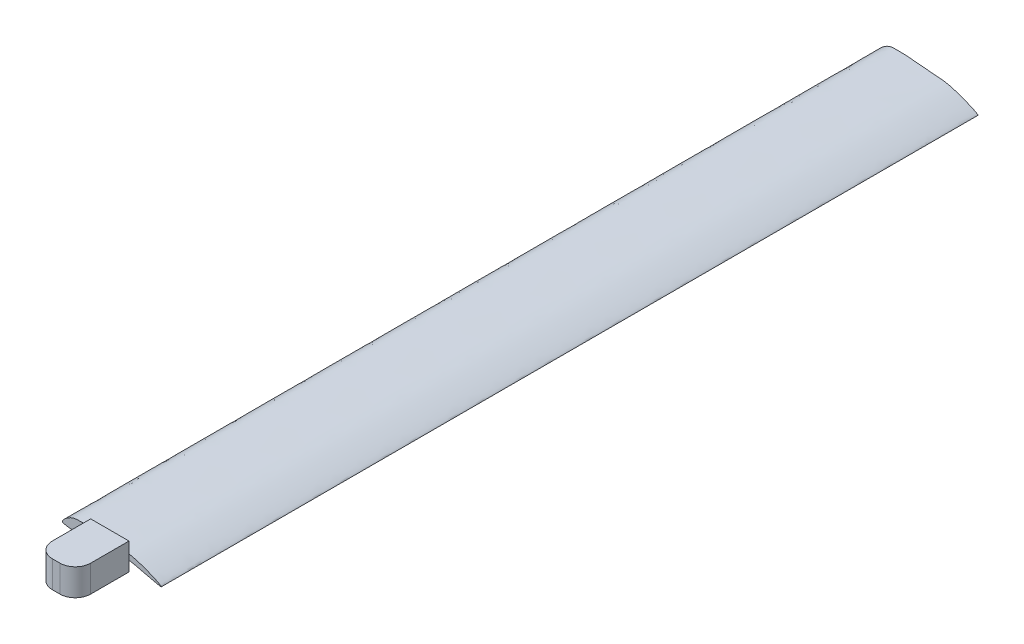
ISO-10303-21;
HEADER;
FILE_DESCRIPTION(('STEP AP214'),'2;1');
FILE_NAME('part.step','',(''),(''),'','','');
FILE_SCHEMA(('AUTOMOTIVE_DESIGN { 1 0 10303 214 1 1 1 1 }'));
ENDSEC;
DATA;
#1=APPLICATION_CONTEXT('core data for automotive mechanical design processes');
#2=APPLICATION_PROTOCOL_DEFINITION('international standard','automotive_design',2000,#1);
#3=PRODUCT_CONTEXT('',#1,'mechanical');
#4=PRODUCT('Part','Part','',(#3));
#5=PRODUCT_RELATED_PRODUCT_CATEGORY('part','',(#4));
#6=PRODUCT_DEFINITION_FORMATION('','',#4);
#7=PRODUCT_DEFINITION_CONTEXT('part definition',#1,'design');
#8=PRODUCT_DEFINITION('design','',#6,#7);
#9=PRODUCT_DEFINITION_SHAPE('','',#8);
#10=(LENGTH_UNIT() NAMED_UNIT(*) SI_UNIT(.MILLI.,.METRE.));
#11=(NAMED_UNIT(*) PLANE_ANGLE_UNIT() SI_UNIT($,.RADIAN.));
#12=(NAMED_UNIT(*) SI_UNIT($,.STERADIAN.) SOLID_ANGLE_UNIT());
#13=UNCERTAINTY_MEASURE_WITH_UNIT(LENGTH_MEASURE(1.E-05),#10,'distance_accuracy_value','');
#14=(GEOMETRIC_REPRESENTATION_CONTEXT(3) GLOBAL_UNCERTAINTY_ASSIGNED_CONTEXT((#13)) GLOBAL_UNIT_ASSIGNED_CONTEXT((#10,
#11,#12)) REPRESENTATION_CONTEXT('',''));
#15=CARTESIAN_POINT('',(0.,0.,0.));
#16=DIRECTION('',(0.,0.,1.));
#17=DIRECTION('',(1.,0.,0.));
#18=AXIS2_PLACEMENT_3D('',#15,#16,#17);
#19=CARTESIAN_POINT('',(-20.3821656050955,35.,-26.671974522293));
#20=DIRECTION('',(0.,0.,1.));
#21=DIRECTION('',(1.,0.,0.));
#22=AXIS2_PLACEMENT_3D('',#19,#20,#21);
#23=PLANE('',#22);
#24=CARTESIAN_POINT('',(-56.722148901199,12.9132931126602,-26.671974522293));
#25=CARTESIAN_POINT('',(-58.5899262985345,14.9651045881638,-26.671974522293));
#26=CARTESIAN_POINT('',(-47.2190457137864,24.5864801628933,-26.671974522293));
#27=CARTESIAN_POINT('',(-31.6878821176664,26.0490869996089,-26.671974522293));
#28=CARTESIAN_POINT('',(-13.5797471137287,24.6112633922639,-26.671974522293));
#29=CARTESIAN_POINT('',(11.3379224926961,21.7313441324484,-26.671974522293));
#30=CARTESIAN_POINT('',(34.4834519129502,22.8207379315413,-26.671974522293));
#31=CARTESIAN_POINT('',(92.5608319116216,-3.10063240531022,-26.671974522293));
#32=CARTESIAN_POINT('',(44.4006869912008,10.5427258415423,-26.671974522293));
#33=CARTESIAN_POINT('',(26.5619400964964,14.1344227278281,-26.671974522293));
#34=CARTESIAN_POINT('',(6.85652039606873,14.2364014984639,-26.671974522293));
#35=CARTESIAN_POINT('',(-16.1776776183614,11.4296581085522,-26.671974522293));
#36=CARTESIAN_POINT('',(-45.1321489395404,9.53115643829552,-26.671974522293));
#37=CARTESIAN_POINT('',(-56.225602315685,12.3678212680318,-26.671974522293));
#38=CARTESIAN_POINT('',(-56.722148901199,12.9132931126602,-26.671974522293));
#39=B_SPLINE_CURVE_WITH_KNOTS('',3,(#24,#25,#26,#27,#28,#29,#30,#31,#32,#33,#34,#35,#36,#37,
#38),.UNSPECIFIED.,.T.,.F.,(4,1,1,1,1,1,1,1,1,1,1,1,4),(0.,0.054770283395099,0.091548509124555,
0.195016084795335,0.250720309556336,0.368624144280432,0.51136475431314,0.642931489725076,
0.680511620881202,0.734131637161095,0.854393798499399,0.985439379849939,0.999999999999999),.UNSPECIFIED.);
#40=CARTESIAN_POINT('',(-20.3821656050955,25.0387096583739,-26.671974522293));
#41=VERTEX_POINT('',#40);
#42=CARTESIAN_POINT('',(29.6178343949045,20.5850740864229,-26.671974522293));
#43=VERTEX_POINT('',#42);
#44=EDGE_CURVE('E54',#41,#43,#39,.T.);
#45=ORIENTED_EDGE('',*,*,#44,.F.);
#46=DIRECTION('',(0.,-1.,0.));
#47=VECTOR('',#46,1.);
#48=CARTESIAN_POINT('',(-20.3821656050955,35.,-26.671974522293));
#49=LINE('',#48,#47);
#50=CARTESIAN_POINT('',(-20.3821656050955,35.,-26.671974522293));
#51=VERTEX_POINT('',#50);
#52=EDGE_CURVE('E119',#51,#41,#49,.T.);
#53=ORIENTED_EDGE('',*,*,#52,.F.);
#54=DIRECTION('',(-1.,0.,0.));
#55=VECTOR('',#54,1.);
#56=CARTESIAN_POINT('',(-20.3821656050955,35.,-26.671974522293));
#57=LINE('',#56,#55);
#58=CARTESIAN_POINT('',(29.6178343949045,35.,-26.671974522293));
#59=VERTEX_POINT('',#58);
#60=EDGE_CURVE('E130',#59,#51,#57,.T.);
#61=ORIENTED_EDGE('',*,*,#60,.F.);
#62=DIRECTION('',(0.,-1.,0.));
#63=VECTOR('',#62,1.);
#64=CARTESIAN_POINT('',(29.6178343949045,35.,-26.671974522293));
#65=LINE('',#64,#63);
#66=EDGE_CURVE('E181',#59,#43,#65,.T.);
#67=ORIENTED_EDGE('',*,*,#66,.T.);
#68=EDGE_LOOP('',(#45,#53,#61,#67));
#69=FACE_BOUND('',#68,.T.);
#70=ADVANCED_FACE('F43',(#69),#23,.F.);
#71=CARTESIAN_POINT('',(29.6178343949045,13.3769521584812,-26.671974522293));
#72=VERTEX_POINT('',#71);
#73=CARTESIAN_POINT('',(-20.3821656050948,11.3783955232231,-26.671974522293));
#74=VERTEX_POINT('',#73);
#75=EDGE_CURVE('E11',#72,#74,#39,.T.);
#76=ORIENTED_EDGE('',*,*,#75,.F.);
#77=CARTESIAN_POINT('',(29.6178343949045,0.,-26.671974522293));
#78=VERTEX_POINT('',#77);
#79=EDGE_CURVE('E180',#72,#78,#65,.T.);
#80=ORIENTED_EDGE('',*,*,#79,.T.);
#81=DIRECTION('',(-1.,0.,0.));
#82=VECTOR('',#81,1.);
#83=CARTESIAN_POINT('',(-20.3821656050955,0.,-26.671974522293));
#84=LINE('',#83,#82);
#85=CARTESIAN_POINT('',(-20.3821656050955,0.,-26.671974522293));
#86=VERTEX_POINT('',#85);
#87=EDGE_CURVE('E127',#78,#86,#84,.T.);
#88=ORIENTED_EDGE('',*,*,#87,.T.);
#89=EDGE_CURVE('E115',#74,#86,#49,.T.);
#90=ORIENTED_EDGE('',*,*,#89,.F.);
#91=EDGE_LOOP('',(#76,#80,#88,#90));
#92=FACE_BOUND('',#91,.T.);
#93=ADVANCED_FACE('F125',(#92),#23,.F.);
#94=CARTESIAN_POINT('',(-20.3821656050955,35.,-26.671974522293));
#95=DIRECTION('',(1.,0.,0.));
#96=DIRECTION('',(0.,0.,-1.));
#97=AXIS2_PLACEMENT_3D('',#94,#95,#96);
#98=PLANE('',#97);
#99=DIRECTION('',(0.,0.,1.));
#100=VECTOR('',#99,1.);
#101=CARTESIAN_POINT('',(-20.3821656050955,0.,-26.671974522293));
#102=LINE('',#101,#100);
#103=CARTESIAN_POINT('',(-20.3821656050955,0.,23.328025477707));
#104=VERTEX_POINT('',#103);
#105=EDGE_CURVE('E166',#86,#104,#102,.T.);
#106=ORIENTED_EDGE('',*,*,#105,.T.);
#107=DIRECTION('',(0.,-1.,0.));
#108=VECTOR('',#107,1.);
#109=CARTESIAN_POINT('',(-20.3821656050955,35.,23.328025477707));
#110=LINE('',#109,#108);
#111=CARTESIAN_POINT('',(-20.3821656050955,35.,23.328025477707));
#112=VERTEX_POINT('',#111);
#113=EDGE_CURVE('E197',#104,#112,#110,.F.);
#114=ORIENTED_EDGE('',*,*,#113,.T.);
#115=DIRECTION('',(0.,0.,1.));
#116=VECTOR('',#115,1.);
#117=CARTESIAN_POINT('',(-20.3821656050955,35.,-26.671974522293));
#118=LINE('',#117,#116);
#119=EDGE_CURVE('E150',#51,#112,#118,.T.);
#120=ORIENTED_EDGE('',*,*,#119,.F.);
#121=ORIENTED_EDGE('',*,*,#52,.T.);
#122=EDGE_CURVE('E112',#41,#74,#49,.T.);
#123=ORIENTED_EDGE('',*,*,#122,.T.);
#124=ORIENTED_EDGE('',*,*,#89,.T.);
#125=EDGE_LOOP('',(#106,#114,#120,#121,#123,#124));
#126=FACE_BOUND('',#125,.T.);
#127=ADVANCED_FACE('F114',(#126),#98,.F.);
#128=CARTESIAN_POINT('',(-20.3821656050955,35.,43.328025477707));
#129=DIRECTION('',(0.,0.,-1.));
#130=DIRECTION('',(-1.,0.,0.));
#131=AXIS2_PLACEMENT_3D('',#128,#129,#130);
#132=PLANE('',#131);
#133=DIRECTION('',(1.,0.,0.));
#134=VECTOR('',#133,1.);
#135=CARTESIAN_POINT('',(-20.3821656050955,35.,43.328025477707));
#136=LINE('',#135,#134);
#137=CARTESIAN_POINT('',(-0.382165605095536,35.,43.328025477707));
#138=VERTEX_POINT('',#137);
#139=CARTESIAN_POINT('',(9.61783439490446,35.,43.328025477707));
#140=VERTEX_POINT('',#139);
#141=EDGE_CURVE('E157',#138,#140,#136,.T.);
#142=ORIENTED_EDGE('',*,*,#141,.F.);
#143=DIRECTION('',(0.,-1.,0.));
#144=VECTOR('',#143,1.);
#145=CARTESIAN_POINT('',(-0.38216560509553,35.,43.328025477707));
#146=LINE('',#145,#144);
#147=CARTESIAN_POINT('',(-0.382165605095536,0.,43.328025477707));
#148=VERTEX_POINT('',#147);
#149=EDGE_CURVE('E187',#138,#148,#146,.T.);
#150=ORIENTED_EDGE('',*,*,#149,.T.);
#151=DIRECTION('',(1.,0.,0.));
#152=VECTOR('',#151,1.);
#153=CARTESIAN_POINT('',(-20.3821656050955,0.,43.328025477707));
#154=LINE('',#153,#152);
#155=CARTESIAN_POINT('',(9.61783439490446,0.,43.328025477707));
#156=VERTEX_POINT('',#155);
#157=EDGE_CURVE('E169',#148,#156,#154,.T.);
#158=ORIENTED_EDGE('',*,*,#157,.T.);
#159=DIRECTION('',(0.,-1.,0.));
#160=VECTOR('',#159,1.);
#161=CARTESIAN_POINT('',(9.61783439490446,35.,43.328025477707));
#162=LINE('',#161,#160);
#163=EDGE_CURVE('E184',#156,#140,#162,.F.);
#164=ORIENTED_EDGE('',*,*,#163,.T.);
#165=EDGE_LOOP('',(#142,#150,#158,#164));
#166=FACE_BOUND('',#165,.T.);
#167=ADVANCED_FACE('F223',(#166),#132,.F.);
#168=CARTESIAN_POINT('',(29.6178343949045,35.,-26.671974522293));
#169=DIRECTION('',(-1.,0.,0.));
#170=DIRECTION('',(0.,0.,1.));
#171=AXIS2_PLACEMENT_3D('',#168,#169,#170);
#172=PLANE('',#171);
#173=DIRECTION('',(0.,0.,-1.));
#174=VECTOR('',#173,1.);
#175=CARTESIAN_POINT('',(29.6178343949045,35.,-26.671974522293));
#176=LINE('',#175,#174);
#177=CARTESIAN_POINT('',(29.6178343949045,35.,23.328025477707));
#178=VERTEX_POINT('',#177);
#179=EDGE_CURVE('E161',#178,#59,#176,.T.);
#180=ORIENTED_EDGE('',*,*,#179,.F.);
#181=DIRECTION('',(0.,-1.,0.));
#182=VECTOR('',#181,1.);
#183=CARTESIAN_POINT('',(29.6178343949045,35.,23.328025477707));
#184=LINE('',#183,#182);
#185=CARTESIAN_POINT('',(29.6178343949045,0.,23.328025477707));
#186=VERTEX_POINT('',#185);
#187=EDGE_CURVE('E47',#178,#186,#184,.T.);
#188=ORIENTED_EDGE('',*,*,#187,.T.);
#189=DIRECTION('',(0.,0.,-1.));
#190=VECTOR('',#189,1.);
#191=CARTESIAN_POINT('',(29.6178343949045,0.,-26.671974522293));
#192=LINE('',#191,#190);
#193=EDGE_CURVE('E173',#186,#78,#192,.T.);
#194=ORIENTED_EDGE('',*,*,#193,.T.);
#195=ORIENTED_EDGE('',*,*,#79,.F.);
#196=EDGE_CURVE('E67',#43,#72,#65,.T.);
#197=ORIENTED_EDGE('',*,*,#196,.F.);
#198=ORIENTED_EDGE('',*,*,#66,.F.);
#199=EDGE_LOOP('',(#180,#188,#194,#195,#197,#198));
#200=FACE_BOUND('',#199,.T.);
#201=ADVANCED_FACE('F212',(#200),#172,.F.);
#202=CARTESIAN_POINT('',(0.,35.,0.));
#203=DIRECTION('',(0.,1.,0.));
#204=DIRECTION('',(0.,0.,1.));
#205=AXIS2_PLACEMENT_3D('',#202,#203,#204);
#206=PLANE('',#205);
#207=ORIENTED_EDGE('',*,*,#119,.T.);
#208=CARTESIAN_POINT('',(-0.38216560509553,35.,23.328025477707));
#209=DIRECTION('',(0.,1.,0.));
#210=DIRECTION('',(0.,0.,1.));
#211=AXIS2_PLACEMENT_3D('',#208,#209,#210);
#212=CIRCLE('',#211,20.);
#213=EDGE_CURVE('E202',#112,#138,#212,.T.);
#214=ORIENTED_EDGE('',*,*,#213,.T.);
#215=ORIENTED_EDGE('',*,*,#141,.T.);
#216=CARTESIAN_POINT('',(9.61783439490447,35.,23.328025477707));
#217=DIRECTION('',(0.,1.,0.));
#218=DIRECTION('',(0.,0.,1.));
#219=AXIS2_PLACEMENT_3D('',#216,#217,#218);
#220=CIRCLE('',#219,20.);
#221=EDGE_CURVE('E200',#140,#178,#220,.T.);
#222=ORIENTED_EDGE('',*,*,#221,.T.);
#223=ORIENTED_EDGE('',*,*,#179,.T.);
#224=ORIENTED_EDGE('',*,*,#60,.T.);
#225=EDGE_LOOP('',(#207,#214,#215,#222,#223,#224));
#226=FACE_BOUND('',#225,.T.);
#227=ADVANCED_FACE('F225',(#226),#206,.T.);
#228=CARTESIAN_POINT('',(0.,0.,0.));
#229=DIRECTION('',(0.,1.,0.));
#230=DIRECTION('',(0.,0.,1.));
#231=AXIS2_PLACEMENT_3D('',#228,#229,#230);
#232=PLANE('',#231);
#233=ORIENTED_EDGE('',*,*,#157,.F.);
#234=CARTESIAN_POINT('',(-0.38216560509553,0.,23.328025477707));
#235=DIRECTION('',(0.,1.,0.));
#236=DIRECTION('',(0.,0.,1.));
#237=AXIS2_PLACEMENT_3D('',#234,#235,#236);
#238=CIRCLE('',#237,20.);
#239=EDGE_CURVE('E194',#148,#104,#238,.F.);
#240=ORIENTED_EDGE('',*,*,#239,.T.);
#241=ORIENTED_EDGE('',*,*,#105,.F.);
#242=ORIENTED_EDGE('',*,*,#87,.F.);
#243=ORIENTED_EDGE('',*,*,#193,.F.);
#244=CARTESIAN_POINT('',(9.61783439490447,0.,23.328025477707));
#245=DIRECTION('',(0.,1.,0.));
#246=DIRECTION('',(0.,0.,1.));
#247=AXIS2_PLACEMENT_3D('',#244,#245,#246);
#248=CIRCLE('',#247,20.);
#249=EDGE_CURVE('E191',#186,#156,#248,.F.);
#250=ORIENTED_EDGE('',*,*,#249,.T.);
#251=EDGE_LOOP('',(#233,#240,#241,#242,#243,#250));
#252=FACE_BOUND('',#251,.T.);
#253=ADVANCED_FACE('F217',(#252),#232,.F.);
#254=CARTESIAN_POINT('',(-0.38216560509553,35.,23.328025477707));
#255=DIRECTION('',(0.,-1.,0.));
#256=DIRECTION('',(0.,0.,-1.));
#257=AXIS2_PLACEMENT_3D('',#254,#255,#256);
#258=CYLINDRICAL_SURFACE('',#257,20.);
#259=ORIENTED_EDGE('',*,*,#213,.F.);
#260=ORIENTED_EDGE('',*,*,#113,.F.);
#261=ORIENTED_EDGE('',*,*,#239,.F.);
#262=ORIENTED_EDGE('',*,*,#149,.F.);
#263=EDGE_LOOP('',(#259,#260,#261,#262));
#264=FACE_BOUND('',#263,.T.);
#265=ADVANCED_FACE('F220',(#264),#258,.T.);
#266=CARTESIAN_POINT('',(9.61783439490447,35.,23.328025477707));
#267=DIRECTION('',(0.,-1.,0.));
#268=DIRECTION('',(0.,0.,-1.));
#269=AXIS2_PLACEMENT_3D('',#266,#267,#268);
#270=CYLINDRICAL_SURFACE('',#269,20.);
#271=ORIENTED_EDGE('',*,*,#221,.F.);
#272=ORIENTED_EDGE('',*,*,#163,.F.);
#273=ORIENTED_EDGE('',*,*,#249,.F.);
#274=ORIENTED_EDGE('',*,*,#187,.F.);
#275=EDGE_LOOP('',(#271,#272,#273,#274));
#276=FACE_BOUND('',#275,.T.);
#277=ADVANCED_FACE('F45',(#276),#270,.T.);
#278=CARTESIAN_POINT('',(71.6521737288934,4.7720944226349,-26.671974522293));
#279=DIRECTION('',(0.,0.,1.));
#280=DIRECTION('',(1.,0.,0.));
#281=AXIS2_PLACEMENT_3D('',#278,#279,#280);
#282=PLANE('',#281);
#283=ORIENTED_EDGE('',*,*,#122,.F.);
#284=EDGE_CURVE('E131',#74,#41,#39,.T.);
#285=ORIENTED_EDGE('',*,*,#284,.F.);
#286=EDGE_LOOP('',(#283,#285));
#287=FACE_BOUND('',#286,.T.);
#288=ADVANCED_FACE('F132',(#287),#282,.T.);
#289=CARTESIAN_POINT('',(-56.722148901199,12.9132931126602,-1091.67197452229));
#290=CARTESIAN_POINT('',(-58.5899262985345,14.9651045881638,-1091.67197452229));
#291=CARTESIAN_POINT('',(-47.2190457137864,24.5864801628933,-1091.67197452229));
#292=CARTESIAN_POINT('',(-31.6878821176664,26.0490869996089,-1091.67197452229));
#293=CARTESIAN_POINT('',(-13.5797471137287,24.6112633922639,-1091.67197452229));
#294=CARTESIAN_POINT('',(11.3379224926961,21.7313441324484,-1091.67197452229));
#295=CARTESIAN_POINT('',(34.4834519129502,22.8207379315413,-1091.67197452229));
#296=CARTESIAN_POINT('',(92.5608319116216,-3.10063240531022,-1091.67197452229));
#297=CARTESIAN_POINT('',(44.4006869912008,10.5427258415423,-1091.67197452229));
#298=CARTESIAN_POINT('',(26.5619400964964,14.1344227278281,-1091.67197452229));
#299=CARTESIAN_POINT('',(6.85652039606873,14.2364014984639,-1091.67197452229));
#300=CARTESIAN_POINT('',(-16.1776776183614,11.4296581085522,-1091.67197452229));
#301=CARTESIAN_POINT('',(-45.1321489395404,9.53115643829552,-1091.67197452229));
#302=CARTESIAN_POINT('',(-56.225602315685,12.3678212680318,-1091.67197452229));
#303=CARTESIAN_POINT('',(-56.722148901199,12.9132931126602,-1091.67197452229));
#304=B_SPLINE_CURVE_WITH_KNOTS('',3,(#289,#290,#291,#292,#293,#294,#295,#296,#297,#298,#299,
#300,#301,#302,#303),.UNSPECIFIED.,.T.,.F.,(4,1,1,1,1,1,1,1,1,1,1,1,4),(0.,0.054770283395099,
0.091548509124555,0.195016084795335,0.250720309556336,0.368624144280432,0.51136475431314,
0.642931489725076,0.680511620881202,0.734131637161095,0.854393798499399,0.985439379849939,
0.999999999999999),.UNSPECIFIED.);
#305=DIRECTION('',(0.,0.,1.));
#306=VECTOR('',#305,1.);
#307=SURFACE_OF_LINEAR_EXTRUSION('',#304,#306);
#308=CARTESIAN_POINT('',(-56.722148901199,12.9132931126602,-1091.67197452229));
#309=VERTEX_POINT('',#308);
#310=EDGE_CURVE('E142',#309,#309,#304,.T.);
#311=ORIENTED_EDGE('',*,*,#310,.F.);
#312=EDGE_LOOP('',(#311));
#313=FACE_BOUND('',#312,.T.);
#314=ORIENTED_EDGE('',*,*,#44,.T.);
#315=EDGE_CURVE('E55',#43,#72,#39,.T.);
#316=ORIENTED_EDGE('',*,*,#315,.T.);
#317=ORIENTED_EDGE('',*,*,#75,.T.);
#318=ORIENTED_EDGE('',*,*,#284,.T.);
#319=EDGE_LOOP('',(#314,#316,#317,#318));
#320=FACE_BOUND('',#319,.T.);
#321=ADVANCED_FACE('F137',(#313,#320),#307,.F.);
#322=CARTESIAN_POINT('',(71.6521737288934,4.7720944226349,-1091.67197452229));
#323=DIRECTION('',(0.,0.,1.));
#324=DIRECTION('',(1.,0.,0.));
#325=AXIS2_PLACEMENT_3D('',#322,#323,#324);
#326=PLANE('',#325);
#327=ORIENTED_EDGE('',*,*,#310,.T.);
#328=EDGE_LOOP('',(#327));
#329=FACE_BOUND('',#328,.T.);
#330=ADVANCED_FACE('F331',(#329),#326,.F.);
#331=ORIENTED_EDGE('',*,*,#315,.F.);
#332=ORIENTED_EDGE('',*,*,#196,.T.);
#333=EDGE_LOOP('',(#331,#332));
#334=FACE_BOUND('',#333,.T.);
#335=ADVANCED_FACE('F232',(#334),#282,.T.);
#336=CLOSED_SHELL('',(#70,#93,#127,#167,#201,#227,#253,#265,#277,#288,#321,#330,#335));
#337=MANIFOLD_SOLID_BREP('B2',#336);
#338=ADVANCED_BREP_SHAPE_REPRESENTATION('',(#18,#337),#14);
#339=SHAPE_DEFINITION_REPRESENTATION(#9,#338);
ENDSEC;
END-ISO-10303-21;
